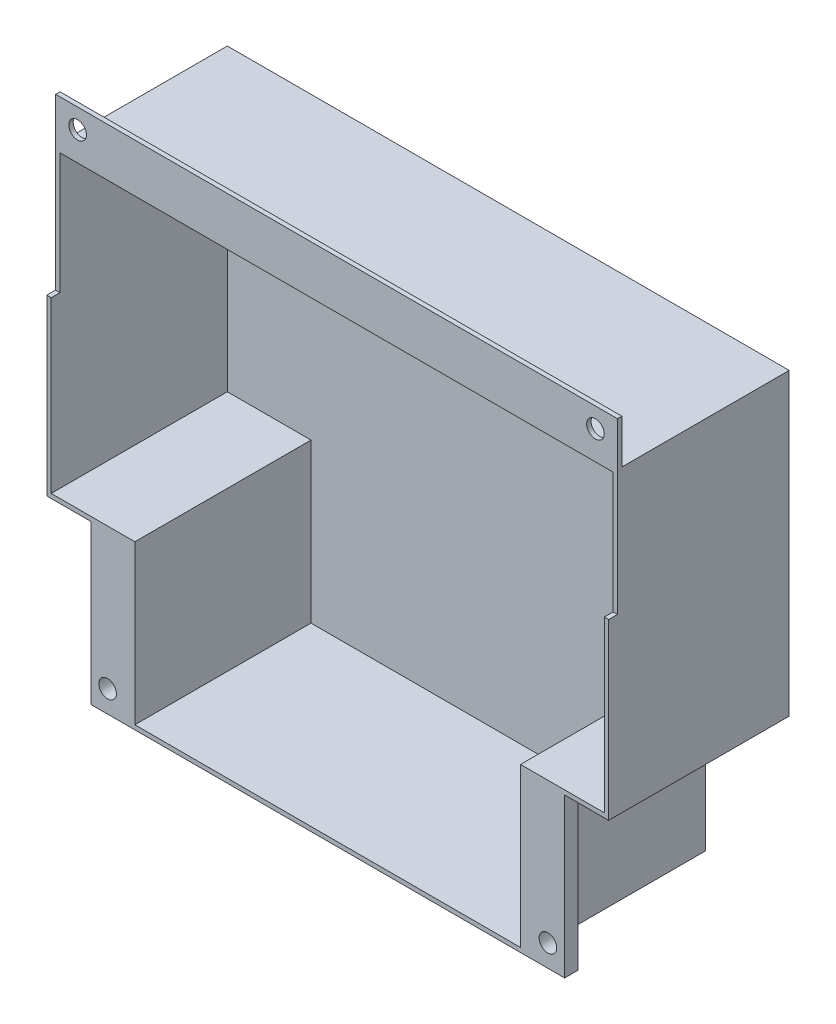
ISO-10303-21;
HEADER;
FILE_DESCRIPTION(('STEP AP214'),'2;1');
FILE_NAME('part.step','',(''),(''),'','','');
FILE_SCHEMA(('AUTOMOTIVE_DESIGN { 1 0 10303 214 1 1 1 1 }'));
ENDSEC;
DATA;
#1=APPLICATION_CONTEXT('core data for automotive mechanical design processes');
#2=APPLICATION_PROTOCOL_DEFINITION('international standard','automotive_design',2000,#1);
#3=PRODUCT_CONTEXT('',#1,'mechanical');
#4=PRODUCT('Part','Part','',(#3));
#5=PRODUCT_RELATED_PRODUCT_CATEGORY('part','',(#4));
#6=PRODUCT_DEFINITION_FORMATION('','',#4);
#7=PRODUCT_DEFINITION_CONTEXT('part definition',#1,'design');
#8=PRODUCT_DEFINITION('design','',#6,#7);
#9=PRODUCT_DEFINITION_SHAPE('','',#8);
#10=(LENGTH_UNIT() NAMED_UNIT(*) SI_UNIT(.MILLI.,.METRE.));
#11=(NAMED_UNIT(*) PLANE_ANGLE_UNIT() SI_UNIT($,.RADIAN.));
#12=(NAMED_UNIT(*) SI_UNIT($,.STERADIAN.) SOLID_ANGLE_UNIT());
#13=UNCERTAINTY_MEASURE_WITH_UNIT(LENGTH_MEASURE(1.E-05),#10,'distance_accuracy_value','');
#14=(GEOMETRIC_REPRESENTATION_CONTEXT(3) GLOBAL_UNCERTAINTY_ASSIGNED_CONTEXT((#13)) GLOBAL_UNIT_ASSIGNED_CONTEXT((#10,
#11,#12)) REPRESENTATION_CONTEXT('',''));
#15=CARTESIAN_POINT('',(0.,0.,0.));
#16=DIRECTION('',(0.,0.,1.));
#17=DIRECTION('',(1.,0.,0.));
#18=AXIS2_PLACEMENT_3D('',#15,#16,#17);
#19=CARTESIAN_POINT('',(44.8,36.,1.));
#20=DIRECTION('',(-1.,0.,0.));
#21=DIRECTION('',(0.,-1.,0.));
#22=AXIS2_PLACEMENT_3D('',#19,#20,#21);
#23=PLANE('',#22);
#24=DIRECTION('',(0.,1.,0.));
#25=VECTOR('',#24,1.);
#26=CARTESIAN_POINT('',(44.8,36.,38.));
#27=LINE('',#26,#25);
#28=CARTESIAN_POINT('',(44.8,0.,38.));
#29=VERTEX_POINT('',#28);
#30=CARTESIAN_POINT('',(44.8,36.,38.));
#31=VERTEX_POINT('',#30);
#32=EDGE_CURVE('E293',#29,#31,#27,.T.);
#33=ORIENTED_EDGE('',*,*,#32,.F.);
#34=DIRECTION('',(0.,0.,-1.));
#35=VECTOR('',#34,1.);
#36=CARTESIAN_POINT('',(44.8,0.,1.));
#37=LINE('',#36,#35);
#38=CARTESIAN_POINT('',(44.8,0.,0.));
#39=VERTEX_POINT('',#38);
#40=EDGE_CURVE('E421',#29,#39,#37,.T.);
#41=ORIENTED_EDGE('',*,*,#40,.T.);
#42=DIRECTION('',(0.,1.,0.));
#43=VECTOR('',#42,1.);
#44=CARTESIAN_POINT('',(44.8,36.,0.));
#45=LINE('',#44,#43);
#46=CARTESIAN_POINT('',(44.8,36.,0.));
#47=VERTEX_POINT('',#46);
#48=EDGE_CURVE('E391',#39,#47,#45,.T.);
#49=ORIENTED_EDGE('',*,*,#48,.T.);
#50=DIRECTION('',(0.,0.,-1.));
#51=VECTOR('',#50,1.);
#52=CARTESIAN_POINT('',(44.8,36.,1.));
#53=LINE('',#52,#51);
#54=EDGE_CURVE('E419',#31,#47,#53,.T.);
#55=ORIENTED_EDGE('',*,*,#54,.F.);
#56=EDGE_LOOP('',(#33,#41,#49,#55));
#57=FACE_BOUND('',#56,.T.);
#58=ADVANCED_FACE('F35',(#57),#23,.F.);
#59=CARTESIAN_POINT('',(-44.8,36.,1.));
#60=DIRECTION('',(1.,0.,0.));
#61=DIRECTION('',(0.,1.,0.));
#62=AXIS2_PLACEMENT_3D('',#59,#60,#61);
#63=PLANE('',#62);
#64=DIRECTION('',(0.,0.,-1.));
#65=VECTOR('',#64,1.);
#66=CARTESIAN_POINT('',(-44.8,0.,1.));
#67=LINE('',#66,#65);
#68=CARTESIAN_POINT('',(-44.8,0.,38.));
#69=VERTEX_POINT('',#68);
#70=CARTESIAN_POINT('',(-44.8,0.,0.));
#71=VERTEX_POINT('',#70);
#72=EDGE_CURVE('E43',#69,#71,#67,.T.);
#73=ORIENTED_EDGE('',*,*,#72,.F.);
#74=DIRECTION('',(0.,1.,0.));
#75=VECTOR('',#74,1.);
#76=CARTESIAN_POINT('',(-44.8,36.,38.));
#77=LINE('',#76,#75);
#78=CARTESIAN_POINT('',(-44.8,36.,38.));
#79=VERTEX_POINT('',#78);
#80=EDGE_CURVE('E270',#69,#79,#77,.T.);
#81=ORIENTED_EDGE('',*,*,#80,.T.);
#82=DIRECTION('',(0.,0.,-1.));
#83=VECTOR('',#82,1.);
#84=CARTESIAN_POINT('',(-44.8,36.,1.));
#85=LINE('',#84,#83);
#86=CARTESIAN_POINT('',(-44.8,36.,0.));
#87=VERTEX_POINT('',#86);
#88=EDGE_CURVE('E407',#79,#87,#85,.T.);
#89=ORIENTED_EDGE('',*,*,#88,.T.);
#90=DIRECTION('',(0.,-1.,0.));
#91=VECTOR('',#90,1.);
#92=CARTESIAN_POINT('',(-44.8,36.,0.));
#93=LINE('',#92,#91);
#94=EDGE_CURVE('E385',#87,#71,#93,.T.);
#95=ORIENTED_EDGE('',*,*,#94,.T.);
#96=EDGE_LOOP('',(#73,#81,#89,#95));
#97=FACE_BOUND('',#96,.T.);
#98=ADVANCED_FACE('F37',(#97),#63,.F.);
#99=CARTESIAN_POINT('',(44.8,0.,1.));
#100=DIRECTION('',(0.,1.,0.));
#101=DIRECTION('',(0.,0.,1.));
#102=AXIS2_PLACEMENT_3D('',#99,#100,#101);
#103=PLANE('',#102);
#104=DIRECTION('',(0.,0.,1.));
#105=VECTOR('',#104,1.);
#106=CARTESIAN_POINT('',(53.8,0.,38.));
#107=LINE('',#106,#105);
#108=CARTESIAN_POINT('',(53.8,0.,38.));
#109=VERTEX_POINT('',#108);
#110=CARTESIAN_POINT('',(53.8,0.,41.));
#111=VERTEX_POINT('',#110);
#112=EDGE_CURVE('E287',#109,#111,#107,.T.);
#113=ORIENTED_EDGE('',*,*,#112,.T.);
#114=DIRECTION('',(1.,0.,0.));
#115=VECTOR('',#114,1.);
#116=CARTESIAN_POINT('',(-44.8,0.,41.));
#117=LINE('',#116,#115);
#118=CARTESIAN_POINT('',(-53.8,0.,41.));
#119=VERTEX_POINT('',#118);
#120=EDGE_CURVE('E377',#119,#111,#117,.T.);
#121=ORIENTED_EDGE('',*,*,#120,.F.);
#122=DIRECTION('',(0.,0.,1.));
#123=VECTOR('',#122,1.);
#124=CARTESIAN_POINT('',(-53.8,0.,38.));
#125=LINE('',#124,#123);
#126=CARTESIAN_POINT('',(-53.8,0.,38.));
#127=VERTEX_POINT('',#126);
#128=EDGE_CURVE('E262',#127,#119,#125,.T.);
#129=ORIENTED_EDGE('',*,*,#128,.F.);
#130=DIRECTION('',(1.,0.,0.));
#131=VECTOR('',#130,1.);
#132=CARTESIAN_POINT('',(-43.8,0.,38.));
#133=LINE('',#132,#131);
#134=EDGE_CURVE('E259',#127,#69,#133,.T.);
#135=ORIENTED_EDGE('',*,*,#134,.T.);
#136=ORIENTED_EDGE('',*,*,#72,.T.);
#137=DIRECTION('',(1.,0.,0.));
#138=VECTOR('',#137,1.);
#139=CARTESIAN_POINT('',(44.8,0.,0.));
#140=LINE('',#139,#138);
#141=EDGE_CURVE('E388',#71,#39,#140,.T.);
#142=ORIENTED_EDGE('',*,*,#141,.T.);
#143=ORIENTED_EDGE('',*,*,#40,.F.);
#144=DIRECTION('',(1.,0.,0.));
#145=VECTOR('',#144,1.);
#146=CARTESIAN_POINT('',(43.8,0.,38.));
#147=LINE('',#146,#145);
#148=EDGE_CURVE('E282',#29,#109,#147,.T.);
#149=ORIENTED_EDGE('',*,*,#148,.T.);
#150=EDGE_LOOP('',(#113,#121,#129,#135,#136,#142,#143,#149));
#151=FACE_BOUND('',#150,.T.);
#152=ADVANCED_FACE('F497',(#151),#103,.F.);
#153=CARTESIAN_POINT('',(63.8,36.,1.));
#154=DIRECTION('',(0.,1.,0.));
#155=DIRECTION('',(0.,0.,1.));
#156=AXIS2_PLACEMENT_3D('',#153,#154,#155);
#157=PLANE('',#156);
#158=DIRECTION('',(1.,0.,0.));
#159=VECTOR('',#158,1.);
#160=CARTESIAN_POINT('',(44.8,36.,41.));
#161=LINE('',#160,#159);
#162=CARTESIAN_POINT('',(53.8,36.,41.));
#163=VERTEX_POINT('',#162);
#164=CARTESIAN_POINT('',(63.8,36.,41.));
#165=VERTEX_POINT('',#164);
#166=EDGE_CURVE('E379',#163,#165,#161,.T.);
#167=ORIENTED_EDGE('',*,*,#166,.F.);
#168=DIRECTION('',(0.,0.,-1.));
#169=VECTOR('',#168,1.);
#170=CARTESIAN_POINT('',(53.8,36.,1.));
#171=LINE('',#170,#169);
#172=CARTESIAN_POINT('',(53.8,36.,38.));
#173=VERTEX_POINT('',#172);
#174=EDGE_CURVE('E295',#163,#173,#171,.T.);
#175=ORIENTED_EDGE('',*,*,#174,.T.);
#176=DIRECTION('',(1.,0.,0.));
#177=VECTOR('',#176,1.);
#178=CARTESIAN_POINT('',(63.8,36.,38.));
#179=LINE('',#178,#177);
#180=EDGE_CURVE('E291',#31,#173,#179,.T.);
#181=ORIENTED_EDGE('',*,*,#180,.F.);
#182=ORIENTED_EDGE('',*,*,#54,.T.);
#183=DIRECTION('',(1.,0.,0.));
#184=VECTOR('',#183,1.);
#185=CARTESIAN_POINT('',(63.8,36.,0.));
#186=LINE('',#185,#184);
#187=CARTESIAN_POINT('',(63.8,36.,0.));
#188=VERTEX_POINT('',#187);
#189=EDGE_CURVE('E394',#47,#188,#186,.T.);
#190=ORIENTED_EDGE('',*,*,#189,.T.);
#191=DIRECTION('',(0.,0.,-1.));
#192=VECTOR('',#191,1.);
#193=CARTESIAN_POINT('',(63.8,36.,1.));
#194=LINE('',#193,#192);
#195=EDGE_CURVE('E416',#165,#188,#194,.T.);
#196=ORIENTED_EDGE('',*,*,#195,.F.);
#197=EDGE_LOOP('',(#167,#175,#181,#182,#190,#196));
#198=FACE_BOUND('',#197,.T.);
#199=ADVANCED_FACE('F501',(#198),#157,.F.);
#200=CARTESIAN_POINT('',(63.8,104.,1.));
#201=DIRECTION('',(-1.,0.,0.));
#202=DIRECTION('',(0.,-1.,0.));
#203=AXIS2_PLACEMENT_3D('',#200,#201,#202);
#204=PLANE('',#203);
#205=DIRECTION('',(0.,-1.,0.));
#206=VECTOR('',#205,1.);
#207=CARTESIAN_POINT('',(63.8000000000001,114.,39.));
#208=LINE('',#207,#206);
#209=CARTESIAN_POINT('',(63.8,114.,39.));
#210=VERTEX_POINT('',#209);
#211=CARTESIAN_POINT('',(63.8000000000001,75.4999999999999,39.));
#212=VERTEX_POINT('',#211);
#213=EDGE_CURVE('E50',#210,#212,#208,.T.);
#214=ORIENTED_EDGE('',*,*,#213,.T.);
#215=DIRECTION('',(0.,0.,1.));
#216=VECTOR('',#215,1.);
#217=CARTESIAN_POINT('',(63.8000000000001,75.4999999999999,41.));
#218=LINE('',#217,#216);
#219=CARTESIAN_POINT('',(63.8000000000001,75.4999999999999,41.));
#220=VERTEX_POINT('',#219);
#221=EDGE_CURVE('E217',#212,#220,#218,.T.);
#222=ORIENTED_EDGE('',*,*,#221,.T.);
#223=DIRECTION('',(0.,1.,0.));
#224=VECTOR('',#223,1.);
#225=CARTESIAN_POINT('',(63.8,36.,41.));
#226=LINE('',#225,#224);
#227=EDGE_CURVE('E381',#165,#220,#226,.T.);
#228=ORIENTED_EDGE('',*,*,#227,.F.);
#229=ORIENTED_EDGE('',*,*,#195,.T.);
#230=DIRECTION('',(0.,1.,0.));
#231=VECTOR('',#230,1.);
#232=CARTESIAN_POINT('',(63.8,104.,0.));
#233=LINE('',#232,#231);
#234=CARTESIAN_POINT('',(63.8,104.,0.));
#235=VERTEX_POINT('',#234);
#236=EDGE_CURVE('E396',#188,#235,#233,.T.);
#237=ORIENTED_EDGE('',*,*,#236,.T.);
#238=DIRECTION('',(0.,0.,-1.));
#239=VECTOR('',#238,1.);
#240=CARTESIAN_POINT('',(63.8,104.,1.));
#241=LINE('',#240,#239);
#242=CARTESIAN_POINT('',(63.8,104.,38.));
#243=VERTEX_POINT('',#242);
#244=EDGE_CURVE('E414',#243,#235,#241,.T.);
#245=ORIENTED_EDGE('',*,*,#244,.F.);
#246=DIRECTION('',(0.,1.,0.));
#247=VECTOR('',#246,1.);
#248=CARTESIAN_POINT('',(63.8,104.,38.));
#249=LINE('',#248,#247);
#250=CARTESIAN_POINT('',(63.8,114.,38.));
#251=VERTEX_POINT('',#250);
#252=EDGE_CURVE('E304',#243,#251,#249,.T.);
#253=ORIENTED_EDGE('',*,*,#252,.T.);
#254=DIRECTION('',(0.,0.,1.));
#255=VECTOR('',#254,1.);
#256=CARTESIAN_POINT('',(63.8,114.,38.));
#257=LINE('',#256,#255);
#258=EDGE_CURVE('E229',#251,#210,#257,.T.);
#259=ORIENTED_EDGE('',*,*,#258,.T.);
#260=EDGE_LOOP('',(#214,#222,#228,#229,#237,#245,#253,#259));
#261=FACE_BOUND('',#260,.T.);
#262=ADVANCED_FACE('F227',(#261),#204,.F.);
#263=CARTESIAN_POINT('',(-63.8,104.,1.));
#264=DIRECTION('',(0.,-1.,0.));
#265=DIRECTION('',(0.,0.,-1.));
#266=AXIS2_PLACEMENT_3D('',#263,#264,#265);
#267=PLANE('',#266);
#268=DIRECTION('',(0.,0.,-1.));
#269=VECTOR('',#268,1.);
#270=CARTESIAN_POINT('',(-63.8,104.,1.));
#271=LINE('',#270,#269);
#272=CARTESIAN_POINT('',(-63.8,104.,38.));
#273=VERTEX_POINT('',#272);
#274=CARTESIAN_POINT('',(-63.8,104.,0.));
#275=VERTEX_POINT('',#274);
#276=EDGE_CURVE('E412',#273,#275,#271,.T.);
#277=ORIENTED_EDGE('',*,*,#276,.F.);
#278=DIRECTION('',(1.,0.,0.));
#279=VECTOR('',#278,1.);
#280=CARTESIAN_POINT('',(63.8,104.,38.));
#281=LINE('',#280,#279);
#282=EDGE_CURVE('E311',#273,#243,#281,.T.);
#283=ORIENTED_EDGE('',*,*,#282,.T.);
#284=ORIENTED_EDGE('',*,*,#244,.T.);
#285=DIRECTION('',(-1.,0.,0.));
#286=VECTOR('',#285,1.);
#287=CARTESIAN_POINT('',(-63.8,104.,0.));
#288=LINE('',#287,#286);
#289=EDGE_CURVE('E399',#235,#275,#288,.T.);
#290=ORIENTED_EDGE('',*,*,#289,.T.);
#291=EDGE_LOOP('',(#277,#283,#284,#290));
#292=FACE_BOUND('',#291,.T.);
#293=ADVANCED_FACE('F452',(#292),#267,.F.);
#294=CARTESIAN_POINT('',(-63.8,104.,1.));
#295=DIRECTION('',(1.,0.,0.));
#296=DIRECTION('',(0.,1.,0.));
#297=AXIS2_PLACEMENT_3D('',#294,#295,#296);
#298=PLANE('',#297);
#299=DIRECTION('',(0.,-1.,0.));
#300=VECTOR('',#299,1.);
#301=CARTESIAN_POINT('',(-63.8,104.,41.));
#302=LINE('',#301,#300);
#303=CARTESIAN_POINT('',(-63.8,75.5,41.));
#304=VERTEX_POINT('',#303);
#305=CARTESIAN_POINT('',(-63.8,36.,41.));
#306=VERTEX_POINT('',#305);
#307=EDGE_CURVE('E383',#304,#306,#302,.T.);
#308=ORIENTED_EDGE('',*,*,#307,.F.);
#309=DIRECTION('',(0.,0.,1.));
#310=VECTOR('',#309,1.);
#311=CARTESIAN_POINT('',(-63.8,75.5,41.));
#312=LINE('',#311,#310);
#313=CARTESIAN_POINT('',(-63.8,75.5,39.));
#314=VERTEX_POINT('',#313);
#315=EDGE_CURVE('E230',#314,#304,#312,.T.);
#316=ORIENTED_EDGE('',*,*,#315,.F.);
#317=DIRECTION('',(0.,-1.,0.));
#318=VECTOR('',#317,1.);
#319=CARTESIAN_POINT('',(-63.8,114.,39.));
#320=LINE('',#319,#318);
#321=CARTESIAN_POINT('',(-63.8,114.,39.));
#322=VERTEX_POINT('',#321);
#323=EDGE_CURVE('E232',#322,#314,#320,.T.);
#324=ORIENTED_EDGE('',*,*,#323,.F.);
#325=DIRECTION('',(0.,0.,1.));
#326=VECTOR('',#325,1.);
#327=CARTESIAN_POINT('',(-63.8,114.,38.));
#328=LINE('',#327,#326);
#329=CARTESIAN_POINT('',(-63.8,114.,38.));
#330=VERTEX_POINT('',#329);
#331=EDGE_CURVE('E314',#330,#322,#328,.T.);
#332=ORIENTED_EDGE('',*,*,#331,.F.);
#333=DIRECTION('',(0.,-1.,0.));
#334=VECTOR('',#333,1.);
#335=CARTESIAN_POINT('',(-63.8,104.,38.));
#336=LINE('',#335,#334);
#337=EDGE_CURVE('E309',#330,#273,#336,.T.);
#338=ORIENTED_EDGE('',*,*,#337,.T.);
#339=ORIENTED_EDGE('',*,*,#276,.T.);
#340=DIRECTION('',(0.,-1.,0.));
#341=VECTOR('',#340,1.);
#342=CARTESIAN_POINT('',(-63.8,104.,0.));
#343=LINE('',#342,#341);
#344=CARTESIAN_POINT('',(-63.8,36.,0.));
#345=VERTEX_POINT('',#344);
#346=EDGE_CURVE('E402',#275,#345,#343,.T.);
#347=ORIENTED_EDGE('',*,*,#346,.T.);
#348=DIRECTION('',(0.,0.,-1.));
#349=VECTOR('',#348,1.);
#350=CARTESIAN_POINT('',(-63.8,36.,1.));
#351=LINE('',#350,#349);
#352=EDGE_CURVE('E409',#306,#345,#351,.T.);
#353=ORIENTED_EDGE('',*,*,#352,.F.);
#354=EDGE_LOOP('',(#308,#316,#324,#332,#338,#339,#347,#353));
#355=FACE_BOUND('',#354,.T.);
#356=ADVANCED_FACE('F465',(#355),#298,.F.);
#357=CARTESIAN_POINT('',(-63.8,36.,1.));
#358=DIRECTION('',(0.,1.,0.));
#359=DIRECTION('',(0.,0.,1.));
#360=AXIS2_PLACEMENT_3D('',#357,#358,#359);
#361=PLANE('',#360);
#362=DIRECTION('',(-1.,0.,0.));
#363=VECTOR('',#362,1.);
#364=CARTESIAN_POINT('',(-63.8,36.,38.));
#365=LINE('',#364,#363);
#366=CARTESIAN_POINT('',(-53.8,36.,38.));
#367=VERTEX_POINT('',#366);
#368=EDGE_CURVE('E267',#79,#367,#365,.T.);
#369=ORIENTED_EDGE('',*,*,#368,.T.);
#370=DIRECTION('',(0.,0.,1.));
#371=VECTOR('',#370,1.);
#372=CARTESIAN_POINT('',(-53.8,36.,1.));
#373=LINE('',#372,#371);
#374=CARTESIAN_POINT('',(-53.8,36.,41.));
#375=VERTEX_POINT('',#374);
#376=EDGE_CURVE('E273',#367,#375,#373,.T.);
#377=ORIENTED_EDGE('',*,*,#376,.T.);
#378=DIRECTION('',(1.,0.,0.));
#379=VECTOR('',#378,1.);
#380=CARTESIAN_POINT('',(-63.8,36.,41.));
#381=LINE('',#380,#379);
#382=EDGE_CURVE('E374',#306,#375,#381,.T.);
#383=ORIENTED_EDGE('',*,*,#382,.F.);
#384=ORIENTED_EDGE('',*,*,#352,.T.);
#385=DIRECTION('',(1.,0.,0.));
#386=VECTOR('',#385,1.);
#387=CARTESIAN_POINT('',(-63.8,36.,0.));
#388=LINE('',#387,#386);
#389=EDGE_CURVE('E404',#345,#87,#388,.T.);
#390=ORIENTED_EDGE('',*,*,#389,.T.);
#391=ORIENTED_EDGE('',*,*,#88,.F.);
#392=EDGE_LOOP('',(#369,#377,#383,#384,#390,#391));
#393=FACE_BOUND('',#392,.T.);
#394=ADVANCED_FACE('F468',(#393),#361,.F.);
#395=CARTESIAN_POINT('',(0.,0.,0.));
#396=DIRECTION('',(0.,0.,-1.));
#397=DIRECTION('',(-1.,0.,0.));
#398=AXIS2_PLACEMENT_3D('',#395,#396,#397);
#399=PLANE('',#398);
#400=ORIENTED_EDGE('',*,*,#94,.F.);
#401=ORIENTED_EDGE('',*,*,#389,.F.);
#402=ORIENTED_EDGE('',*,*,#346,.F.);
#403=ORIENTED_EDGE('',*,*,#289,.F.);
#404=ORIENTED_EDGE('',*,*,#236,.F.);
#405=ORIENTED_EDGE('',*,*,#189,.F.);
#406=ORIENTED_EDGE('',*,*,#48,.F.);
#407=ORIENTED_EDGE('',*,*,#141,.F.);
#408=EDGE_LOOP('',(#400,#401,#402,#403,#404,#405,#406,#407));
#409=FACE_BOUND('',#408,.T.);
#410=ADVANCED_FACE('F460',(#409),#399,.T.);
#411=CARTESIAN_POINT('',(0.,0.,41.));
#412=DIRECTION('',(0.,0.,-1.));
#413=DIRECTION('',(-1.,0.,0.));
#414=AXIS2_PLACEMENT_3D('',#411,#412,#413);
#415=PLANE('',#414);
#416=ORIENTED_EDGE('',*,*,#227,.T.);
#417=DIRECTION('',(-1.,0.,0.));
#418=VECTOR('',#417,1.);
#419=CARTESIAN_POINT('',(63.8000000000001,75.4999999999999,41.));
#420=LINE('',#419,#418);
#421=CARTESIAN_POINT('',(62.8,75.4999999999999,41.));
#422=VERTEX_POINT('',#421);
#423=EDGE_CURVE('E220',#220,#422,#420,.T.);
#424=ORIENTED_EDGE('',*,*,#423,.T.);
#425=DIRECTION('',(0.,1.,0.));
#426=VECTOR('',#425,1.);
#427=CARTESIAN_POINT('',(62.8,37.,41.));
#428=LINE('',#427,#426);
#429=CARTESIAN_POINT('',(62.8,37.,41.));
#430=VERTEX_POINT('',#429);
#431=EDGE_CURVE('E319',#430,#422,#428,.T.);
#432=ORIENTED_EDGE('',*,*,#431,.F.);
#433=DIRECTION('',(1.,0.,0.));
#434=VECTOR('',#433,1.);
#435=CARTESIAN_POINT('',(43.8,37.,41.));
#436=LINE('',#435,#434);
#437=CARTESIAN_POINT('',(43.8,37.,41.));
#438=VERTEX_POINT('',#437);
#439=EDGE_CURVE('E334',#438,#430,#436,.T.);
#440=ORIENTED_EDGE('',*,*,#439,.F.);
#441=DIRECTION('',(0.,1.,0.));
#442=VECTOR('',#441,1.);
#443=CARTESIAN_POINT('',(43.8,0.999999999999989,41.));
#444=LINE('',#443,#442);
#445=CARTESIAN_POINT('',(43.8,0.999999999999989,41.));
#446=VERTEX_POINT('',#445);
#447=EDGE_CURVE('E331',#446,#438,#444,.T.);
#448=ORIENTED_EDGE('',*,*,#447,.F.);
#449=DIRECTION('',(1.,0.,0.));
#450=VECTOR('',#449,1.);
#451=CARTESIAN_POINT('',(-43.8,0.999999999999989,41.));
#452=LINE('',#451,#450);
#453=CARTESIAN_POINT('',(-43.8,0.999999999999989,41.));
#454=VERTEX_POINT('',#453);
#455=EDGE_CURVE('E329',#454,#446,#452,.T.);
#456=ORIENTED_EDGE('',*,*,#455,.F.);
#457=DIRECTION('',(0.,-1.,0.));
#458=VECTOR('',#457,1.);
#459=CARTESIAN_POINT('',(-43.8,37.,41.));
#460=LINE('',#459,#458);
#461=CARTESIAN_POINT('',(-43.8,37.,41.));
#462=VERTEX_POINT('',#461);
#463=EDGE_CURVE('E327',#462,#454,#460,.T.);
#464=ORIENTED_EDGE('',*,*,#463,.F.);
#465=DIRECTION('',(1.,0.,0.));
#466=VECTOR('',#465,1.);
#467=CARTESIAN_POINT('',(-62.8,37.,41.));
#468=LINE('',#467,#466);
#469=CARTESIAN_POINT('',(-62.8,37.,41.));
#470=VERTEX_POINT('',#469);
#471=EDGE_CURVE('E325',#470,#462,#468,.T.);
#472=ORIENTED_EDGE('',*,*,#471,.F.);
#473=DIRECTION('',(0.,-1.,0.));
#474=VECTOR('',#473,1.);
#475=CARTESIAN_POINT('',(-62.8,103.,41.));
#476=LINE('',#475,#474);
#477=CARTESIAN_POINT('',(-62.8,75.5,41.));
#478=VERTEX_POINT('',#477);
#479=EDGE_CURVE('E322',#478,#470,#476,.T.);
#480=ORIENTED_EDGE('',*,*,#479,.F.);
#481=EDGE_CURVE('E213',#478,#304,#420,.T.);
#482=ORIENTED_EDGE('',*,*,#481,.T.);
#483=ORIENTED_EDGE('',*,*,#307,.T.);
#484=ORIENTED_EDGE('',*,*,#382,.T.);
#485=DIRECTION('',(0.,-1.,0.));
#486=VECTOR('',#485,1.);
#487=CARTESIAN_POINT('',(-53.8,37.,41.));
#488=LINE('',#487,#486);
#489=EDGE_CURVE('E254',#375,#119,#488,.T.);
#490=ORIENTED_EDGE('',*,*,#489,.T.);
#491=ORIENTED_EDGE('',*,*,#120,.T.);
#492=DIRECTION('',(0.,1.,0.));
#493=VECTOR('',#492,1.);
#494=CARTESIAN_POINT('',(53.8,37.,41.));
#495=LINE('',#494,#493);
#496=EDGE_CURVE('E58',#111,#163,#495,.T.);
#497=ORIENTED_EDGE('',*,*,#496,.T.);
#498=ORIENTED_EDGE('',*,*,#166,.T.);
#499=EDGE_LOOP('',(#416,#424,#432,#440,#448,#456,#464,#472,#480,#482,#483,#484,#490,#491,#497,#498));
#500=FACE_BOUND('',#499,.T.);
#501=CARTESIAN_POINT('',(50.,5.,41.));
#502=DIRECTION('',(0.,0.,1.));
#503=DIRECTION('',(1.,0.,0.));
#504=AXIS2_PLACEMENT_3D('',#501,#502,#503);
#505=CIRCLE('',#504,2.);
#506=CARTESIAN_POINT('',(52.,5.,41.));
#507=VERTEX_POINT('',#506);
#508=EDGE_CURVE('E276',#507,#507,#505,.T.);
#509=ORIENTED_EDGE('',*,*,#508,.F.);
#510=EDGE_LOOP('',(#509));
#511=FACE_BOUND('',#510,.T.);
#512=CARTESIAN_POINT('',(-50.,5.,41.));
#513=DIRECTION('',(0.,0.,1.));
#514=DIRECTION('',(-1.,0.,0.));
#515=AXIS2_PLACEMENT_3D('',#512,#513,#514);
#516=CIRCLE('',#515,2.);
#517=CARTESIAN_POINT('',(-52.,5.,41.));
#518=VERTEX_POINT('',#517);
#519=EDGE_CURVE('E250',#518,#518,#516,.T.);
#520=ORIENTED_EDGE('',*,*,#519,.F.);
#521=EDGE_LOOP('',(#520));
#522=FACE_BOUND('',#521,.T.);
#523=ADVANCED_FACE('F470',(#500,#511,#522),#415,.F.);
#524=CARTESIAN_POINT('',(62.8,37.,41.));
#525=DIRECTION('',(-1.,0.,0.));
#526=DIRECTION('',(0.,0.,1.));
#527=AXIS2_PLACEMENT_3D('',#524,#525,#526);
#528=PLANE('',#527);
#529=DIRECTION('',(0.,0.,1.));
#530=VECTOR('',#529,1.);
#531=CARTESIAN_POINT('',(62.8,75.4999999999999,41.));
#532=LINE('',#531,#530);
#533=CARTESIAN_POINT('',(62.8,75.4999999999999,39.));
#534=VERTEX_POINT('',#533);
#535=EDGE_CURVE('E248',#534,#422,#532,.T.);
#536=ORIENTED_EDGE('',*,*,#535,.F.);
#537=DIRECTION('',(0.,-1.,0.));
#538=VECTOR('',#537,1.);
#539=CARTESIAN_POINT('',(62.8,37.,39.));
#540=LINE('',#539,#538);
#541=CARTESIAN_POINT('',(62.8,103.,39.));
#542=VERTEX_POINT('',#541);
#543=EDGE_CURVE('E210',#542,#534,#540,.T.);
#544=ORIENTED_EDGE('',*,*,#543,.F.);
#545=DIRECTION('',(0.,0.,-1.));
#546=VECTOR('',#545,1.);
#547=CARTESIAN_POINT('',(62.8,103.,41.));
#548=LINE('',#547,#546);
#549=CARTESIAN_POINT('',(62.8,103.,1.));
#550=VERTEX_POINT('',#549);
#551=EDGE_CURVE('E372',#542,#550,#548,.T.);
#552=ORIENTED_EDGE('',*,*,#551,.T.);
#553=DIRECTION('',(0.,1.,0.));
#554=VECTOR('',#553,1.);
#555=CARTESIAN_POINT('',(62.8,37.,1.));
#556=LINE('',#555,#554);
#557=CARTESIAN_POINT('',(62.8,37.,1.));
#558=VERTEX_POINT('',#557);
#559=EDGE_CURVE('E317',#558,#550,#556,.T.);
#560=ORIENTED_EDGE('',*,*,#559,.F.);
#561=DIRECTION('',(0.,0.,-1.));
#562=VECTOR('',#561,1.);
#563=CARTESIAN_POINT('',(62.8,37.,41.));
#564=LINE('',#563,#562);
#565=EDGE_CURVE('E336',#430,#558,#564,.T.);
#566=ORIENTED_EDGE('',*,*,#565,.F.);
#567=ORIENTED_EDGE('',*,*,#431,.T.);
#568=EDGE_LOOP('',(#536,#544,#552,#560,#566,#567));
#569=FACE_BOUND('',#568,.T.);
#570=ADVANCED_FACE('F521',(#569),#528,.T.);
#571=CARTESIAN_POINT('',(62.8,103.,41.));
#572=DIRECTION('',(0.,-1.,0.));
#573=DIRECTION('',(1.,0.,0.));
#574=AXIS2_PLACEMENT_3D('',#571,#572,#573);
#575=PLANE('',#574);
#576=DIRECTION('',(1.,0.,0.));
#577=VECTOR('',#576,1.);
#578=CARTESIAN_POINT('',(62.8,103.,39.));
#579=LINE('',#578,#577);
#580=CARTESIAN_POINT('',(-62.8,103.,39.));
#581=VERTEX_POINT('',#580);
#582=EDGE_CURVE('E245',#581,#542,#579,.T.);
#583=ORIENTED_EDGE('',*,*,#582,.F.);
#584=DIRECTION('',(0.,0.,-1.));
#585=VECTOR('',#584,1.);
#586=CARTESIAN_POINT('',(-62.8,103.,41.));
#587=LINE('',#586,#585);
#588=CARTESIAN_POINT('',(-62.8,103.,1.));
#589=VERTEX_POINT('',#588);
#590=EDGE_CURVE('E370',#581,#589,#587,.T.);
#591=ORIENTED_EDGE('',*,*,#590,.T.);
#592=DIRECTION('',(-1.,0.,0.));
#593=VECTOR('',#592,1.);
#594=CARTESIAN_POINT('',(62.8,103.,1.));
#595=LINE('',#594,#593);
#596=EDGE_CURVE('E339',#550,#589,#595,.T.);
#597=ORIENTED_EDGE('',*,*,#596,.F.);
#598=ORIENTED_EDGE('',*,*,#551,.F.);
#599=EDGE_LOOP('',(#583,#591,#597,#598));
#600=FACE_BOUND('',#599,.T.);
#601=ADVANCED_FACE('F552',(#600),#575,.T.);
#602=CARTESIAN_POINT('',(-62.8,103.,41.));
#603=DIRECTION('',(1.,0.,0.));
#604=DIRECTION('',(0.,1.,0.));
#605=AXIS2_PLACEMENT_3D('',#602,#603,#604);
#606=PLANE('',#605);
#607=DIRECTION('',(0.,0.,-1.));
#608=VECTOR('',#607,1.);
#609=CARTESIAN_POINT('',(-62.8,75.5,41.));
#610=LINE('',#609,#608);
#611=CARTESIAN_POINT('',(-62.8,75.5,39.));
#612=VERTEX_POINT('',#611);
#613=EDGE_CURVE('E11',#478,#612,#610,.T.);
#614=ORIENTED_EDGE('',*,*,#613,.F.);
#615=ORIENTED_EDGE('',*,*,#479,.T.);
#616=DIRECTION('',(0.,0.,-1.));
#617=VECTOR('',#616,1.);
#618=CARTESIAN_POINT('',(-62.8,37.,41.));
#619=LINE('',#618,#617);
#620=CARTESIAN_POINT('',(-62.8,37.,1.));
#621=VERTEX_POINT('',#620);
#622=EDGE_CURVE('E368',#470,#621,#619,.T.);
#623=ORIENTED_EDGE('',*,*,#622,.T.);
#624=DIRECTION('',(0.,-1.,0.));
#625=VECTOR('',#624,1.);
#626=CARTESIAN_POINT('',(-62.8,103.,1.));
#627=LINE('',#626,#625);
#628=EDGE_CURVE('E342',#589,#621,#627,.T.);
#629=ORIENTED_EDGE('',*,*,#628,.F.);
#630=ORIENTED_EDGE('',*,*,#590,.F.);
#631=DIRECTION('',(0.,1.,0.));
#632=VECTOR('',#631,1.);
#633=CARTESIAN_POINT('',(-62.8,103.,39.));
#634=LINE('',#633,#632);
#635=EDGE_CURVE('E243',#612,#581,#634,.T.);
#636=ORIENTED_EDGE('',*,*,#635,.F.);
#637=EDGE_LOOP('',(#614,#615,#623,#629,#630,#636));
#638=FACE_BOUND('',#637,.T.);
#639=ADVANCED_FACE('F547',(#638),#606,.T.);
#640=CARTESIAN_POINT('',(-62.8,37.,41.));
#641=DIRECTION('',(0.,1.,0.));
#642=DIRECTION('',(-1.,0.,0.));
#643=AXIS2_PLACEMENT_3D('',#640,#641,#642);
#644=PLANE('',#643);
#645=ORIENTED_EDGE('',*,*,#471,.T.);
#646=DIRECTION('',(0.,0.,-1.));
#647=VECTOR('',#646,1.);
#648=CARTESIAN_POINT('',(-43.8,37.,41.));
#649=LINE('',#648,#647);
#650=CARTESIAN_POINT('',(-43.8,37.,1.));
#651=VERTEX_POINT('',#650);
#652=EDGE_CURVE('E366',#462,#651,#649,.T.);
#653=ORIENTED_EDGE('',*,*,#652,.T.);
#654=DIRECTION('',(1.,0.,0.));
#655=VECTOR('',#654,1.);
#656=CARTESIAN_POINT('',(-62.8,37.,1.));
#657=LINE('',#656,#655);
#658=EDGE_CURVE('E345',#621,#651,#657,.T.);
#659=ORIENTED_EDGE('',*,*,#658,.F.);
#660=ORIENTED_EDGE('',*,*,#622,.F.);
#661=EDGE_LOOP('',(#645,#653,#659,#660));
#662=FACE_BOUND('',#661,.T.);
#663=ADVANCED_FACE('F543',(#662),#644,.T.);
#664=CARTESIAN_POINT('',(-43.8,37.,41.));
#665=DIRECTION('',(1.,0.,0.));
#666=DIRECTION('',(0.,0.,-1.));
#667=AXIS2_PLACEMENT_3D('',#664,#665,#666);
#668=PLANE('',#667);
#669=DIRECTION('',(0.,-1.,0.));
#670=VECTOR('',#669,1.);
#671=CARTESIAN_POINT('',(-43.8,37.,1.));
#672=LINE('',#671,#670);
#673=CARTESIAN_POINT('',(-43.8,0.999999999999989,1.));
#674=VERTEX_POINT('',#673);
#675=EDGE_CURVE('E348',#651,#674,#672,.T.);
#676=ORIENTED_EDGE('',*,*,#675,.F.);
#677=ORIENTED_EDGE('',*,*,#652,.F.);
#678=ORIENTED_EDGE('',*,*,#463,.T.);
#679=DIRECTION('',(0.,0.,-1.));
#680=VECTOR('',#679,1.);
#681=CARTESIAN_POINT('',(-43.8,0.999999999999989,41.));
#682=LINE('',#681,#680);
#683=EDGE_CURVE('E364',#454,#674,#682,.T.);
#684=ORIENTED_EDGE('',*,*,#683,.T.);
#685=EDGE_LOOP('',(#676,#677,#678,#684));
#686=FACE_BOUND('',#685,.T.);
#687=ADVANCED_FACE('F538',(#686),#668,.T.);
#688=CARTESIAN_POINT('',(-43.8,0.999999999999989,41.));
#689=DIRECTION('',(0.,1.,0.));
#690=DIRECTION('',(0.,0.,1.));
#691=AXIS2_PLACEMENT_3D('',#688,#689,#690);
#692=PLANE('',#691);
#693=DIRECTION('',(1.,0.,0.));
#694=VECTOR('',#693,1.);
#695=CARTESIAN_POINT('',(-43.8,0.999999999999989,1.));
#696=LINE('',#695,#694);
#697=CARTESIAN_POINT('',(43.8,0.999999999999989,1.));
#698=VERTEX_POINT('',#697);
#699=EDGE_CURVE('E351',#674,#698,#696,.T.);
#700=ORIENTED_EDGE('',*,*,#699,.F.);
#701=ORIENTED_EDGE('',*,*,#683,.F.);
#702=ORIENTED_EDGE('',*,*,#455,.T.);
#703=DIRECTION('',(0.,0.,-1.));
#704=VECTOR('',#703,1.);
#705=CARTESIAN_POINT('',(43.8,0.999999999999989,41.));
#706=LINE('',#705,#704);
#707=EDGE_CURVE('E362',#446,#698,#706,.T.);
#708=ORIENTED_EDGE('',*,*,#707,.T.);
#709=EDGE_LOOP('',(#700,#701,#702,#708));
#710=FACE_BOUND('',#709,.T.);
#711=ADVANCED_FACE('F534',(#710),#692,.T.);
#712=CARTESIAN_POINT('',(43.8,0.999999999999989,41.));
#713=DIRECTION('',(-1.,0.,0.));
#714=DIRECTION('',(0.,0.,1.));
#715=AXIS2_PLACEMENT_3D('',#712,#713,#714);
#716=PLANE('',#715);
#717=DIRECTION('',(0.,0.,-1.));
#718=VECTOR('',#717,1.);
#719=CARTESIAN_POINT('',(43.8,37.,41.));
#720=LINE('',#719,#718);
#721=CARTESIAN_POINT('',(43.8,37.,1.));
#722=VERTEX_POINT('',#721);
#723=EDGE_CURVE('E360',#438,#722,#720,.T.);
#724=ORIENTED_EDGE('',*,*,#723,.T.);
#725=DIRECTION('',(0.,1.,0.));
#726=VECTOR('',#725,1.);
#727=CARTESIAN_POINT('',(43.8,0.999999999999989,1.));
#728=LINE('',#727,#726);
#729=EDGE_CURVE('E354',#698,#722,#728,.T.);
#730=ORIENTED_EDGE('',*,*,#729,.F.);
#731=ORIENTED_EDGE('',*,*,#707,.F.);
#732=ORIENTED_EDGE('',*,*,#447,.T.);
#733=EDGE_LOOP('',(#724,#730,#731,#732));
#734=FACE_BOUND('',#733,.T.);
#735=ADVANCED_FACE('F530',(#734),#716,.T.);
#736=CARTESIAN_POINT('',(43.8,37.,41.));
#737=DIRECTION('',(0.,1.,0.));
#738=DIRECTION('',(0.,0.,1.));
#739=AXIS2_PLACEMENT_3D('',#736,#737,#738);
#740=PLANE('',#739);
#741=ORIENTED_EDGE('',*,*,#439,.T.);
#742=ORIENTED_EDGE('',*,*,#565,.T.);
#743=DIRECTION('',(1.,0.,0.));
#744=VECTOR('',#743,1.);
#745=CARTESIAN_POINT('',(43.8,37.,1.));
#746=LINE('',#745,#744);
#747=EDGE_CURVE('E323',#722,#558,#746,.T.);
#748=ORIENTED_EDGE('',*,*,#747,.F.);
#749=ORIENTED_EDGE('',*,*,#723,.F.);
#750=EDGE_LOOP('',(#741,#742,#748,#749));
#751=FACE_BOUND('',#750,.T.);
#752=ADVANCED_FACE('F487',(#751),#740,.T.);
#753=CARTESIAN_POINT('',(0.,0.,1.));
#754=DIRECTION('',(0.,0.,-1.));
#755=DIRECTION('',(-1.,0.,0.));
#756=AXIS2_PLACEMENT_3D('',#753,#754,#755);
#757=PLANE('',#756);
#758=ORIENTED_EDGE('',*,*,#747,.T.);
#759=ORIENTED_EDGE('',*,*,#559,.T.);
#760=ORIENTED_EDGE('',*,*,#596,.T.);
#761=ORIENTED_EDGE('',*,*,#628,.T.);
#762=ORIENTED_EDGE('',*,*,#658,.T.);
#763=ORIENTED_EDGE('',*,*,#675,.T.);
#764=ORIENTED_EDGE('',*,*,#699,.T.);
#765=ORIENTED_EDGE('',*,*,#729,.T.);
#766=EDGE_LOOP('',(#758,#759,#760,#761,#762,#763,#764,#765));
#767=FACE_BOUND('',#766,.T.);
#768=ADVANCED_FACE('F482',(#767),#757,.F.);
#769=CARTESIAN_POINT('',(63.8,114.,38.));
#770=DIRECTION('',(0.,1.,0.));
#771=DIRECTION('',(-1.,0.,0.));
#772=AXIS2_PLACEMENT_3D('',#769,#770,#771);
#773=PLANE('',#772);
#774=DIRECTION('',(-1.,0.,0.));
#775=VECTOR('',#774,1.);
#776=CARTESIAN_POINT('',(63.8000000000001,114.,39.));
#777=LINE('',#776,#775);
#778=EDGE_CURVE('E224',#210,#322,#777,.T.);
#779=ORIENTED_EDGE('',*,*,#778,.F.);
#780=ORIENTED_EDGE('',*,*,#258,.F.);
#781=DIRECTION('',(-1.,0.,0.));
#782=VECTOR('',#781,1.);
#783=CARTESIAN_POINT('',(63.8,114.,38.));
#784=LINE('',#783,#782);
#785=EDGE_CURVE('E306',#251,#330,#784,.T.);
#786=ORIENTED_EDGE('',*,*,#785,.T.);
#787=ORIENTED_EDGE('',*,*,#331,.T.);
#788=EDGE_LOOP('',(#779,#780,#786,#787));
#789=FACE_BOUND('',#788,.T.);
#790=ADVANCED_FACE('F443',(#789),#773,.T.);
#791=CARTESIAN_POINT('',(0.,0.,38.));
#792=DIRECTION('',(0.,0.,1.));
#793=DIRECTION('',(1.,0.,0.));
#794=AXIS2_PLACEMENT_3D('',#791,#792,#793);
#795=PLANE('',#794);
#796=CARTESIAN_POINT('',(-58.8,109.5,38.));
#797=DIRECTION('',(0.,0.,1.));
#798=DIRECTION('',(-1.,0.,0.));
#799=AXIS2_PLACEMENT_3D('',#796,#797,#798);
#800=CIRCLE('',#799,2.);
#801=CARTESIAN_POINT('',(-60.8,109.5,38.));
#802=VERTEX_POINT('',#801);
#803=EDGE_CURVE('E298',#802,#802,#800,.T.);
#804=ORIENTED_EDGE('',*,*,#803,.T.);
#805=EDGE_LOOP('',(#804));
#806=FACE_BOUND('',#805,.T.);
#807=CARTESIAN_POINT('',(58.8,109.5,38.));
#808=DIRECTION('',(0.,0.,1.));
#809=DIRECTION('',(1.,0.,0.));
#810=AXIS2_PLACEMENT_3D('',#807,#808,#809);
#811=CIRCLE('',#810,2.);
#812=CARTESIAN_POINT('',(60.8,109.5,38.));
#813=VERTEX_POINT('',#812);
#814=EDGE_CURVE('E301',#813,#813,#811,.T.);
#815=ORIENTED_EDGE('',*,*,#814,.T.);
#816=EDGE_LOOP('',(#815));
#817=FACE_BOUND('',#816,.T.);
#818=ORIENTED_EDGE('',*,*,#252,.F.);
#819=ORIENTED_EDGE('',*,*,#282,.F.);
#820=ORIENTED_EDGE('',*,*,#337,.F.);
#821=ORIENTED_EDGE('',*,*,#785,.F.);
#822=EDGE_LOOP('',(#818,#819,#820,#821));
#823=FACE_BOUND('',#822,.T.);
#824=ADVANCED_FACE('F437',(#806,#817,#823),#795,.F.);
#825=CARTESIAN_POINT('',(58.8,109.5,38.));
#826=DIRECTION('',(0.,0.,1.));
#827=DIRECTION('',(1.,0.,0.));
#828=AXIS2_PLACEMENT_3D('',#825,#826,#827);
#829=CYLINDRICAL_SURFACE('',#828,2.);
#830=CARTESIAN_POINT('',(58.8,109.5,39.));
#831=DIRECTION('',(0.,0.,-1.));
#832=DIRECTION('',(0.,1.,0.));
#833=AXIS2_PLACEMENT_3D('',#830,#831,#832);
#834=CIRCLE('',#833,2.);
#835=CARTESIAN_POINT('',(58.8,111.5,39.));
#836=VERTEX_POINT('',#835);
#837=EDGE_CURVE('E240',#836,#836,#834,.F.);
#838=ORIENTED_EDGE('',*,*,#837,.T.);
#839=EDGE_LOOP('',(#838));
#840=FACE_BOUND('',#839,.T.);
#841=ORIENTED_EDGE('',*,*,#814,.F.);
#842=EDGE_LOOP('',(#841));
#843=FACE_BOUND('',#842,.T.);
#844=ADVANCED_FACE('F434',(#840,#843),#829,.F.);
#845=CARTESIAN_POINT('',(-58.8,109.5,38.));
#846=DIRECTION('',(0.,0.,1.));
#847=DIRECTION('',(1.,0.,0.));
#848=AXIS2_PLACEMENT_3D('',#845,#846,#847);
#849=CYLINDRICAL_SURFACE('',#848,2.);
#850=CARTESIAN_POINT('',(-58.8,109.5,39.));
#851=DIRECTION('',(0.,0.,-1.));
#852=DIRECTION('',(0.,1.,0.));
#853=AXIS2_PLACEMENT_3D('',#850,#851,#852);
#854=CIRCLE('',#853,2.);
#855=CARTESIAN_POINT('',(-58.8,111.5,39.));
#856=VERTEX_POINT('',#855);
#857=EDGE_CURVE('E237',#856,#856,#854,.F.);
#858=ORIENTED_EDGE('',*,*,#857,.T.);
#859=EDGE_LOOP('',(#858));
#860=FACE_BOUND('',#859,.T.);
#861=ORIENTED_EDGE('',*,*,#803,.F.);
#862=EDGE_LOOP('',(#861));
#863=FACE_BOUND('',#862,.T.);
#864=ADVANCED_FACE('F426',(#860,#863),#849,.F.);
#865=CARTESIAN_POINT('',(53.8,37.,38.));
#866=DIRECTION('',(1.,0.,0.));
#867=DIRECTION('',(0.,1.,0.));
#868=AXIS2_PLACEMENT_3D('',#865,#866,#867);
#869=PLANE('',#868);
#870=ORIENTED_EDGE('',*,*,#174,.F.);
#871=ORIENTED_EDGE('',*,*,#496,.F.);
#872=ORIENTED_EDGE('',*,*,#112,.F.);
#873=DIRECTION('',(0.,1.,0.));
#874=VECTOR('',#873,1.);
#875=CARTESIAN_POINT('',(53.8,37.,38.));
#876=LINE('',#875,#874);
#877=EDGE_CURVE('E284',#109,#173,#876,.T.);
#878=ORIENTED_EDGE('',*,*,#877,.T.);
#879=EDGE_LOOP('',(#870,#871,#872,#878));
#880=FACE_BOUND('',#879,.T.);
#881=ADVANCED_FACE('F514',(#880),#869,.T.);
#882=CARTESIAN_POINT('',(0.,0.,38.));
#883=DIRECTION('',(0.,0.,1.));
#884=DIRECTION('',(1.,0.,0.));
#885=AXIS2_PLACEMENT_3D('',#882,#883,#884);
#886=PLANE('',#885);
#887=CARTESIAN_POINT('',(50.,5.,38.));
#888=DIRECTION('',(0.,0.,1.));
#889=DIRECTION('',(1.,0.,0.));
#890=AXIS2_PLACEMENT_3D('',#887,#888,#889);
#891=CIRCLE('',#890,2.);
#892=CARTESIAN_POINT('',(52.,5.,38.));
#893=VERTEX_POINT('',#892);
#894=EDGE_CURVE('E277',#893,#893,#891,.T.);
#895=ORIENTED_EDGE('',*,*,#894,.T.);
#896=EDGE_LOOP('',(#895));
#897=FACE_BOUND('',#896,.T.);
#898=ORIENTED_EDGE('',*,*,#148,.F.);
#899=ORIENTED_EDGE('',*,*,#32,.T.);
#900=ORIENTED_EDGE('',*,*,#180,.T.);
#901=ORIENTED_EDGE('',*,*,#877,.F.);
#902=EDGE_LOOP('',(#898,#899,#900,#901));
#903=FACE_BOUND('',#902,.T.);
#904=ADVANCED_FACE('F681',(#897,#903),#886,.F.);
#905=CARTESIAN_POINT('',(50.,5.,38.));
#906=DIRECTION('',(0.,0.,1.));
#907=DIRECTION('',(1.,0.,0.));
#908=AXIS2_PLACEMENT_3D('',#905,#906,#907);
#909=CYLINDRICAL_SURFACE('',#908,2.);
#910=ORIENTED_EDGE('',*,*,#894,.F.);
#911=EDGE_LOOP('',(#910));
#912=FACE_BOUND('',#911,.T.);
#913=ORIENTED_EDGE('',*,*,#508,.T.);
#914=EDGE_LOOP('',(#913));
#915=FACE_BOUND('',#914,.T.);
#916=ADVANCED_FACE('F677',(#912,#915),#909,.F.);
#917=CARTESIAN_POINT('',(-53.8,37.,38.));
#918=DIRECTION('',(-1.,0.,0.));
#919=DIRECTION('',(0.,-1.,0.));
#920=AXIS2_PLACEMENT_3D('',#917,#918,#919);
#921=PLANE('',#920);
#922=ORIENTED_EDGE('',*,*,#376,.F.);
#923=DIRECTION('',(0.,-1.,0.));
#924=VECTOR('',#923,1.);
#925=CARTESIAN_POINT('',(-53.8,37.,38.));
#926=LINE('',#925,#924);
#927=EDGE_CURVE('E257',#367,#127,#926,.T.);
#928=ORIENTED_EDGE('',*,*,#927,.T.);
#929=ORIENTED_EDGE('',*,*,#128,.T.);
#930=ORIENTED_EDGE('',*,*,#489,.F.);
#931=EDGE_LOOP('',(#922,#928,#929,#930));
#932=FACE_BOUND('',#931,.T.);
#933=ADVANCED_FACE('F673',(#932),#921,.T.);
#934=CARTESIAN_POINT('',(0.,0.,38.));
#935=DIRECTION('',(0.,0.,-1.));
#936=DIRECTION('',(-1.,0.,0.));
#937=AXIS2_PLACEMENT_3D('',#934,#935,#936);
#938=PLANE('',#937);
#939=CARTESIAN_POINT('',(-50.,5.,38.));
#940=DIRECTION('',(0.,0.,1.));
#941=DIRECTION('',(-1.,0.,0.));
#942=AXIS2_PLACEMENT_3D('',#939,#940,#941);
#943=CIRCLE('',#942,2.);
#944=CARTESIAN_POINT('',(-52.,5.,38.));
#945=VERTEX_POINT('',#944);
#946=EDGE_CURVE('E251',#945,#945,#943,.T.);
#947=ORIENTED_EDGE('',*,*,#946,.T.);
#948=EDGE_LOOP('',(#947));
#949=FACE_BOUND('',#948,.T.);
#950=ORIENTED_EDGE('',*,*,#80,.F.);
#951=ORIENTED_EDGE('',*,*,#134,.F.);
#952=ORIENTED_EDGE('',*,*,#927,.F.);
#953=ORIENTED_EDGE('',*,*,#368,.F.);
#954=EDGE_LOOP('',(#950,#951,#952,#953));
#955=FACE_BOUND('',#954,.T.);
#956=ADVANCED_FACE('F669',(#949,#955),#938,.T.);
#957=CARTESIAN_POINT('',(-50.,5.,38.));
#958=DIRECTION('',(0.,0.,1.));
#959=DIRECTION('',(1.,0.,0.));
#960=AXIS2_PLACEMENT_3D('',#957,#958,#959);
#961=CYLINDRICAL_SURFACE('',#960,2.);
#962=ORIENTED_EDGE('',*,*,#946,.F.);
#963=EDGE_LOOP('',(#962));
#964=FACE_BOUND('',#963,.T.);
#965=ORIENTED_EDGE('',*,*,#519,.T.);
#966=EDGE_LOOP('',(#965));
#967=FACE_BOUND('',#966,.T.);
#968=ADVANCED_FACE('F648',(#964,#967),#961,.F.);
#969=CARTESIAN_POINT('',(63.8000000000001,75.4999999999999,41.));
#970=DIRECTION('',(0.,-1.,0.));
#971=DIRECTION('',(1.,0.,0.));
#972=AXIS2_PLACEMENT_3D('',#969,#970,#971);
#973=PLANE('',#972);
#974=ORIENTED_EDGE('',*,*,#535,.T.);
#975=ORIENTED_EDGE('',*,*,#423,.F.);
#976=ORIENTED_EDGE('',*,*,#221,.F.);
#977=DIRECTION('',(-1.,0.,0.));
#978=VECTOR('',#977,1.);
#979=CARTESIAN_POINT('',(63.8000000000001,75.4999999999999,39.));
#980=LINE('',#979,#978);
#981=EDGE_CURVE('E205',#212,#534,#980,.T.);
#982=ORIENTED_EDGE('',*,*,#981,.T.);
#983=EDGE_LOOP('',(#974,#975,#976,#982));
#984=FACE_BOUND('',#983,.T.);
#985=ADVANCED_FACE('F218',(#984),#973,.F.);
#986=CARTESIAN_POINT('',(63.8000000000001,114.,39.));
#987=DIRECTION('',(0.,0.,-1.));
#988=DIRECTION('',(0.,1.,0.));
#989=AXIS2_PLACEMENT_3D('',#986,#987,#988);
#990=PLANE('',#989);
#991=ORIENTED_EDGE('',*,*,#543,.T.);
#992=ORIENTED_EDGE('',*,*,#981,.F.);
#993=ORIENTED_EDGE('',*,*,#213,.F.);
#994=ORIENTED_EDGE('',*,*,#778,.T.);
#995=ORIENTED_EDGE('',*,*,#323,.T.);
#996=EDGE_CURVE('E214',#612,#314,#980,.T.);
#997=ORIENTED_EDGE('',*,*,#996,.F.);
#998=ORIENTED_EDGE('',*,*,#635,.T.);
#999=ORIENTED_EDGE('',*,*,#582,.T.);
#1000=EDGE_LOOP('',(#991,#992,#993,#994,#995,#997,#998,#999));
#1001=FACE_BOUND('',#1000,.T.);
#1002=ORIENTED_EDGE('',*,*,#857,.F.);
#1003=EDGE_LOOP('',(#1002));
#1004=FACE_BOUND('',#1003,.T.);
#1005=ORIENTED_EDGE('',*,*,#837,.F.);
#1006=EDGE_LOOP('',(#1005));
#1007=FACE_BOUND('',#1006,.T.);
#1008=ADVANCED_FACE('F207',(#1001,#1004,#1007),#990,.F.);
#1009=ORIENTED_EDGE('',*,*,#613,.T.);
#1010=ORIENTED_EDGE('',*,*,#996,.T.);
#1011=ORIENTED_EDGE('',*,*,#315,.T.);
#1012=ORIENTED_EDGE('',*,*,#481,.F.);
#1013=EDGE_LOOP('',(#1009,#1010,#1011,#1012));
#1014=FACE_BOUND('',#1013,.T.);
#1015=ADVANCED_FACE('F430',(#1014),#973,.F.);
#1016=CLOSED_SHELL('',(#58,#98,#152,#199,#262,#293,#356,#394,#410,#523,#570,#601,#639,#663,#687,
#711,#735,#752,#768,#790,#824,#844,#864,#881,#904,#916,#933,#956,#968,#985,#1008,#1015));
#1017=MANIFOLD_SOLID_BREP('B2',#1016);
#1018=ADVANCED_BREP_SHAPE_REPRESENTATION('',(#18,#1017),#14);
#1019=SHAPE_DEFINITION_REPRESENTATION(#9,#1018);
ENDSEC;
END-ISO-10303-21;
